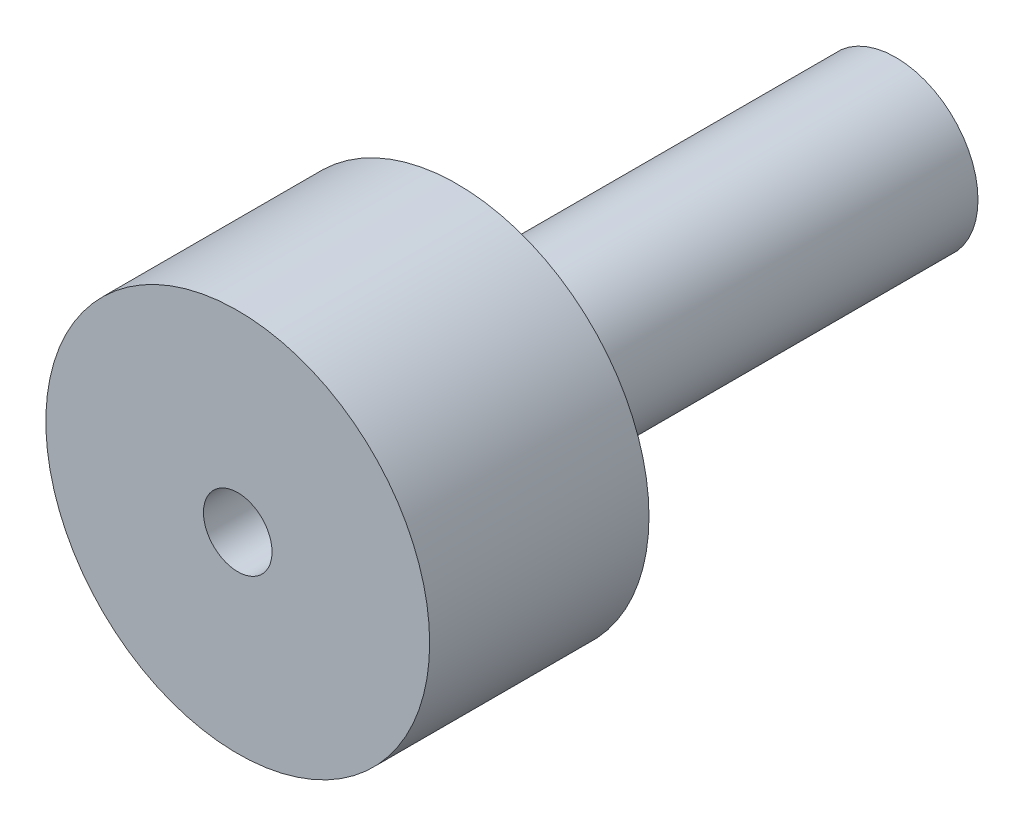
ISO-10303-21;
HEADER;
FILE_DESCRIPTION(('STEP AP214'),'2;1');
FILE_NAME('part.step','',(''),(''),'','','');
FILE_SCHEMA(('AUTOMOTIVE_DESIGN { 1 0 10303 214 1 1 1 1 }'));
ENDSEC;
DATA;
#1=APPLICATION_CONTEXT('core data for automotive mechanical design processes');
#2=APPLICATION_PROTOCOL_DEFINITION('international standard','automotive_design',2000,#1);
#3=PRODUCT_CONTEXT('',#1,'mechanical');
#4=PRODUCT('Part','Part','',(#3));
#5=PRODUCT_RELATED_PRODUCT_CATEGORY('part','',(#4));
#6=PRODUCT_DEFINITION_FORMATION('','',#4);
#7=PRODUCT_DEFINITION_CONTEXT('part definition',#1,'design');
#8=PRODUCT_DEFINITION('design','',#6,#7);
#9=PRODUCT_DEFINITION_SHAPE('','',#8);
#10=(LENGTH_UNIT() NAMED_UNIT(*) SI_UNIT(.MILLI.,.METRE.));
#11=(NAMED_UNIT(*) PLANE_ANGLE_UNIT() SI_UNIT($,.RADIAN.));
#12=(NAMED_UNIT(*) SI_UNIT($,.STERADIAN.) SOLID_ANGLE_UNIT());
#13=UNCERTAINTY_MEASURE_WITH_UNIT(LENGTH_MEASURE(1.E-05),#10,'distance_accuracy_value','');
#14=(GEOMETRIC_REPRESENTATION_CONTEXT(3) GLOBAL_UNCERTAINTY_ASSIGNED_CONTEXT((#13)) GLOBAL_UNIT_ASSIGNED_CONTEXT((#10,
#11,#12)) REPRESENTATION_CONTEXT('',''));
#15=CARTESIAN_POINT('',(0.,0.,0.));
#16=DIRECTION('',(0.,0.,1.));
#17=DIRECTION('',(1.,0.,0.));
#18=AXIS2_PLACEMENT_3D('',#15,#16,#17);
#19=CARTESIAN_POINT('',(0.,0.,16.));
#20=DIRECTION('',(0.,0.,1.));
#21=DIRECTION('',(1.,0.,0.));
#22=AXIS2_PLACEMENT_3D('',#19,#20,#21);
#23=PLANE('',#22);
#24=CARTESIAN_POINT('',(0.,0.,16.));
#25=DIRECTION('',(0.,0.,1.));
#26=DIRECTION('',(1.,0.,0.));
#27=AXIS2_PLACEMENT_3D('',#24,#25,#26);
#28=CIRCLE('',#27,14.);
#29=CARTESIAN_POINT('',(14.,0.,16.));
#30=VERTEX_POINT('',#29);
#31=EDGE_CURVE('E46',#30,#30,#28,.T.);
#32=ORIENTED_EDGE('',*,*,#31,.T.);
#33=EDGE_LOOP('',(#32));
#34=FACE_BOUND('',#33,.T.);
#35=CARTESIAN_POINT('',(0.,0.,16.));
#36=DIRECTION('',(0.,0.,1.));
#37=DIRECTION('',(1.,0.,0.));
#38=AXIS2_PLACEMENT_3D('',#35,#36,#37);
#39=CIRCLE('',#38,2.5);
#40=CARTESIAN_POINT('',(2.5,0.,16.));
#41=VERTEX_POINT('',#40);
#42=EDGE_CURVE('E55',#41,#41,#39,.T.);
#43=ORIENTED_EDGE('',*,*,#42,.F.);
#44=EDGE_LOOP('',(#43));
#45=FACE_BOUND('',#44,.T.);
#46=ADVANCED_FACE('F39',(#34,#45),#23,.T.);
#47=CARTESIAN_POINT('',(0.,0.,0.));
#48=DIRECTION('',(0.,0.,1.));
#49=DIRECTION('',(1.,0.,0.));
#50=AXIS2_PLACEMENT_3D('',#47,#48,#49);
#51=PLANE('',#50);
#52=CARTESIAN_POINT('',(0.,0.,0.));
#53=DIRECTION('',(0.,0.,1.));
#54=DIRECTION('',(1.,0.,0.));
#55=AXIS2_PLACEMENT_3D('',#52,#53,#54);
#56=CIRCLE('',#55,6.);
#57=CARTESIAN_POINT('',(6.,0.,0.));
#58=VERTEX_POINT('',#57);
#59=EDGE_CURVE('E10',#58,#58,#56,.F.);
#60=ORIENTED_EDGE('',*,*,#59,.F.);
#61=EDGE_LOOP('',(#60));
#62=FACE_BOUND('',#61,.T.);
#63=CARTESIAN_POINT('',(0.,0.,0.));
#64=DIRECTION('',(0.,0.,1.));
#65=DIRECTION('',(1.,0.,0.));
#66=AXIS2_PLACEMENT_3D('',#63,#64,#65);
#67=CIRCLE('',#66,14.);
#68=CARTESIAN_POINT('',(14.,0.,0.));
#69=VERTEX_POINT('',#68);
#70=EDGE_CURVE('E50',#69,#69,#67,.T.);
#71=ORIENTED_EDGE('',*,*,#70,.F.);
#72=EDGE_LOOP('',(#71));
#73=FACE_BOUND('',#72,.T.);
#74=ADVANCED_FACE('F81',(#62,#73),#51,.F.);
#75=CARTESIAN_POINT('',(0.,0.,16.));
#76=DIRECTION('',(0.,0.,-1.));
#77=DIRECTION('',(-1.,0.,0.));
#78=AXIS2_PLACEMENT_3D('',#75,#76,#77);
#79=CYLINDRICAL_SURFACE('',#78,14.);
#80=ORIENTED_EDGE('',*,*,#31,.F.);
#81=EDGE_LOOP('',(#80));
#82=FACE_BOUND('',#81,.T.);
#83=ORIENTED_EDGE('',*,*,#70,.T.);
#84=EDGE_LOOP('',(#83));
#85=FACE_BOUND('',#84,.T.);
#86=ADVANCED_FACE('F41',(#82,#85),#79,.T.);
#87=CARTESIAN_POINT('',(0.,0.,16.));
#88=DIRECTION('',(0.,0.,-1.));
#89=DIRECTION('',(-1.,0.,0.));
#90=AXIS2_PLACEMENT_3D('',#87,#88,#89);
#91=CYLINDRICAL_SURFACE('',#90,2.5);
#92=ORIENTED_EDGE('',*,*,#42,.T.);
#93=EDGE_LOOP('',(#92));
#94=FACE_BOUND('',#93,.T.);
#95=CARTESIAN_POINT('',(0.,0.,-32.));
#96=DIRECTION('',(0.,0.,-1.));
#97=DIRECTION('',(-1.,0.,0.));
#98=AXIS2_PLACEMENT_3D('',#95,#96,#97);
#99=CIRCLE('',#98,2.5);
#100=CARTESIAN_POINT('',(-2.5,0.,-32.));
#101=VERTEX_POINT('',#100);
#102=EDGE_CURVE('E62',#101,#101,#99,.F.);
#103=ORIENTED_EDGE('',*,*,#102,.F.);
#104=EDGE_LOOP('',(#103));
#105=FACE_BOUND('',#104,.T.);
#106=ADVANCED_FACE('F69',(#94,#105),#91,.F.);
#107=CARTESIAN_POINT('',(0.,0.,-32.));
#108=DIRECTION('',(0.,0.,1.));
#109=DIRECTION('',(1.,0.,0.));
#110=AXIS2_PLACEMENT_3D('',#107,#108,#109);
#111=CYLINDRICAL_SURFACE('',#110,6.);
#112=CARTESIAN_POINT('',(0.,0.,-32.));
#113=DIRECTION('',(0.,0.,-1.));
#114=DIRECTION('',(-1.,0.,0.));
#115=AXIS2_PLACEMENT_3D('',#112,#113,#114);
#116=CIRCLE('',#115,6.);
#117=CARTESIAN_POINT('',(-6.,0.,-32.));
#118=VERTEX_POINT('',#117);
#119=EDGE_CURVE('E59',#118,#118,#116,.T.);
#120=ORIENTED_EDGE('',*,*,#119,.F.);
#121=EDGE_LOOP('',(#120));
#122=FACE_BOUND('',#121,.T.);
#123=ORIENTED_EDGE('',*,*,#59,.T.);
#124=EDGE_LOOP('',(#123));
#125=FACE_BOUND('',#124,.T.);
#126=ADVANCED_FACE('F71',(#122,#125),#111,.T.);
#127=CARTESIAN_POINT('',(0.,0.,-32.));
#128=DIRECTION('',(0.,0.,-1.));
#129=DIRECTION('',(-1.,0.,0.));
#130=AXIS2_PLACEMENT_3D('',#127,#128,#129);
#131=PLANE('',#130);
#132=ORIENTED_EDGE('',*,*,#102,.T.);
#133=EDGE_LOOP('',(#132));
#134=FACE_BOUND('',#133,.T.);
#135=ORIENTED_EDGE('',*,*,#119,.T.);
#136=EDGE_LOOP('',(#135));
#137=FACE_BOUND('',#136,.T.);
#138=ADVANCED_FACE('F66',(#134,#137),#131,.T.);
#139=CLOSED_SHELL('',(#46,#74,#86,#106,#126,#138));
#140=MANIFOLD_SOLID_BREP('B2',#139);
#141=ADVANCED_BREP_SHAPE_REPRESENTATION('',(#18,#140),#14);
#142=SHAPE_DEFINITION_REPRESENTATION(#9,#141);
ENDSEC;
END-ISO-10303-21;
